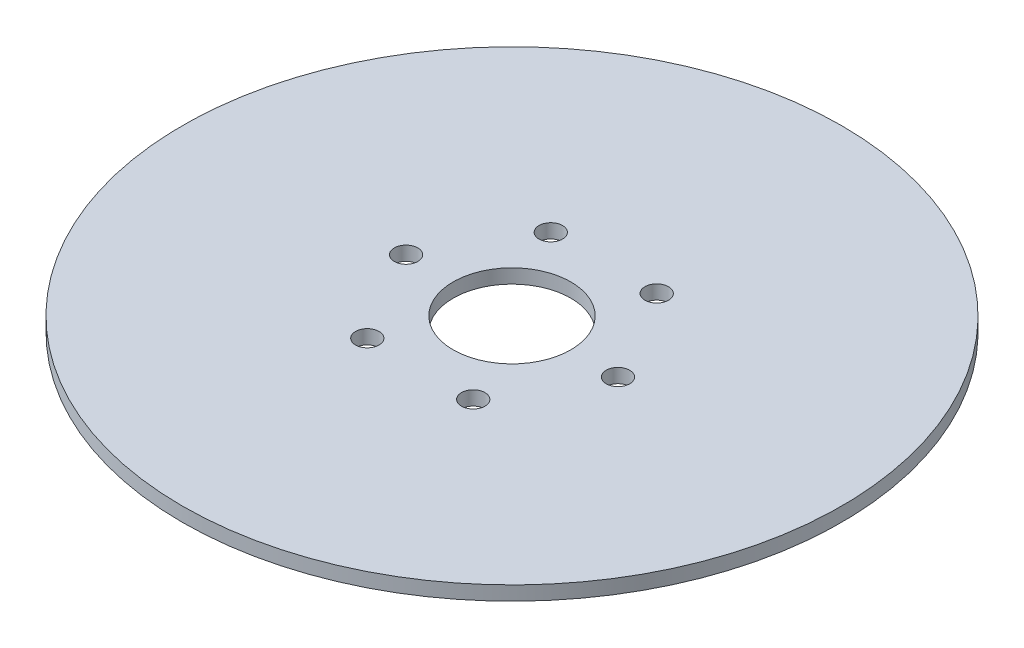
ISO-10303-21;
HEADER;
FILE_DESCRIPTION(('STEP AP214'),'2;1');
FILE_NAME('part.step','',(''),(''),'','','');
FILE_SCHEMA(('AUTOMOTIVE_DESIGN { 1 0 10303 214 1 1 1 1 }'));
ENDSEC;
DATA;
#1=APPLICATION_CONTEXT('core data for automotive mechanical design processes');
#2=APPLICATION_PROTOCOL_DEFINITION('international standard','automotive_design',2000,#1);
#3=PRODUCT_CONTEXT('',#1,'mechanical');
#4=PRODUCT('Part','Part','',(#3));
#5=PRODUCT_RELATED_PRODUCT_CATEGORY('part','',(#4));
#6=PRODUCT_DEFINITION_FORMATION('','',#4);
#7=PRODUCT_DEFINITION_CONTEXT('part definition',#1,'design');
#8=PRODUCT_DEFINITION('design','',#6,#7);
#9=PRODUCT_DEFINITION_SHAPE('','',#8);
#10=(LENGTH_UNIT() NAMED_UNIT(*) SI_UNIT(.MILLI.,.METRE.));
#11=(NAMED_UNIT(*) PLANE_ANGLE_UNIT() SI_UNIT($,.RADIAN.));
#12=(NAMED_UNIT(*) SI_UNIT($,.STERADIAN.) SOLID_ANGLE_UNIT());
#13=UNCERTAINTY_MEASURE_WITH_UNIT(LENGTH_MEASURE(1.E-05),#10,'distance_accuracy_value','');
#14=(GEOMETRIC_REPRESENTATION_CONTEXT(3) GLOBAL_UNCERTAINTY_ASSIGNED_CONTEXT((#13)) GLOBAL_UNIT_ASSIGNED_CONTEXT((#10,
#11,#12)) REPRESENTATION_CONTEXT('',''));
#15=CARTESIAN_POINT('',(0.,0.,0.));
#16=DIRECTION('',(0.,0.,1.));
#17=DIRECTION('',(1.,0.,0.));
#18=AXIS2_PLACEMENT_3D('',#15,#16,#17);
#19=CARTESIAN_POINT('',(0.,3.,0.));
#20=DIRECTION('',(0.,1.,0.));
#21=DIRECTION('',(0.,0.,1.));
#22=AXIS2_PLACEMENT_3D('',#19,#20,#21);
#23=PLANE('',#22);
#24=CARTESIAN_POINT('',(-11.2499999999998,3.,-19.48557158515));
#25=DIRECTION('',(0.,1.,0.));
#26=DIRECTION('',(0.,0.,1.));
#27=AXIS2_PLACEMENT_3D('',#24,#25,#26);
#28=CIRCLE('',#27,2.5);
#29=CARTESIAN_POINT('',(-11.2499999999998,3.,-16.98557158515));
#30=VERTEX_POINT('',#29);
#31=EDGE_CURVE('E74',#30,#30,#28,.T.);
#32=ORIENTED_EDGE('',*,*,#31,.F.);
#33=EDGE_LOOP('',(#32));
#34=FACE_BOUND('',#33,.T.);
#35=CARTESIAN_POINT('',(-11.2500000000001,3.,19.4855715851498));
#36=DIRECTION('',(0.,1.,0.));
#37=DIRECTION('',(0.,0.,1.));
#38=AXIS2_PLACEMENT_3D('',#35,#36,#37);
#39=CIRCLE('',#38,2.5);
#40=CARTESIAN_POINT('',(-11.2500000000001,3.,21.9855715851498));
#41=VERTEX_POINT('',#40);
#42=EDGE_CURVE('E62',#41,#41,#39,.T.);
#43=ORIENTED_EDGE('',*,*,#42,.F.);
#44=EDGE_LOOP('',(#43));
#45=FACE_BOUND('',#44,.T.);
#46=CARTESIAN_POINT('',(22.5,3.,0.));
#47=DIRECTION('',(0.,1.,0.));
#48=DIRECTION('',(0.,0.,1.));
#49=AXIS2_PLACEMENT_3D('',#46,#47,#48);
#50=CIRCLE('',#49,2.5);
#51=CARTESIAN_POINT('',(22.5,3.,2.5));
#52=VERTEX_POINT('',#51);
#53=EDGE_CURVE('E50',#52,#52,#50,.T.);
#54=ORIENTED_EDGE('',*,*,#53,.F.);
#55=EDGE_LOOP('',(#54));
#56=FACE_BOUND('',#55,.T.);
#57=CARTESIAN_POINT('',(0.,3.,0.));
#58=DIRECTION('',(0.,1.,0.));
#59=DIRECTION('',(0.,0.,1.));
#60=AXIS2_PLACEMENT_3D('',#57,#58,#59);
#61=CIRCLE('',#60,70.);
#62=CARTESIAN_POINT('',(0.,3.,70.));
#63=VERTEX_POINT('',#62);
#64=EDGE_CURVE('E10',#63,#63,#61,.T.);
#65=ORIENTED_EDGE('',*,*,#64,.T.);
#66=EDGE_LOOP('',(#65));
#67=FACE_BOUND('',#66,.T.);
#68=CARTESIAN_POINT('',(0.,3.,0.));
#69=DIRECTION('',(0.,1.,0.));
#70=DIRECTION('',(0.,0.,1.));
#71=AXIS2_PLACEMENT_3D('',#68,#69,#70);
#72=CIRCLE('',#71,12.5);
#73=CARTESIAN_POINT('',(0.,3.,12.5));
#74=VERTEX_POINT('',#73);
#75=EDGE_CURVE('E45',#74,#74,#72,.T.);
#76=ORIENTED_EDGE('',*,*,#75,.F.);
#77=EDGE_LOOP('',(#76));
#78=FACE_BOUND('',#77,.T.);
#79=CARTESIAN_POINT('',(11.25,3.,19.4855715851499));
#80=DIRECTION('',(0.,1.,0.));
#81=DIRECTION('',(0.,0.,1.));
#82=AXIS2_PLACEMENT_3D('',#79,#80,#81);
#83=CIRCLE('',#82,2.5);
#84=CARTESIAN_POINT('',(11.25,3.,21.9855715851499));
#85=VERTEX_POINT('',#84);
#86=EDGE_CURVE('E56',#85,#85,#83,.T.);
#87=ORIENTED_EDGE('',*,*,#86,.F.);
#88=EDGE_LOOP('',(#87));
#89=FACE_BOUND('',#88,.T.);
#90=CARTESIAN_POINT('',(-22.5,3.,-1.56992474575901E-13));
#91=DIRECTION('',(0.,1.,0.));
#92=DIRECTION('',(0.,0.,1.));
#93=AXIS2_PLACEMENT_3D('',#90,#91,#92);
#94=CIRCLE('',#93,2.5);
#95=CARTESIAN_POINT('',(-22.5,3.,2.49999999999984));
#96=VERTEX_POINT('',#95);
#97=EDGE_CURVE('E68',#96,#96,#94,.T.);
#98=ORIENTED_EDGE('',*,*,#97,.F.);
#99=EDGE_LOOP('',(#98));
#100=FACE_BOUND('',#99,.T.);
#101=CARTESIAN_POINT('',(11.2500000000002,3.,-19.4855715851497));
#102=DIRECTION('',(0.,1.,0.));
#103=DIRECTION('',(0.,0.,1.));
#104=AXIS2_PLACEMENT_3D('',#101,#102,#103);
#105=CIRCLE('',#104,2.5);
#106=CARTESIAN_POINT('',(11.2500000000002,3.,-16.9855715851497));
#107=VERTEX_POINT('',#106);
#108=EDGE_CURVE('E80',#107,#107,#105,.T.);
#109=ORIENTED_EDGE('',*,*,#108,.F.);
#110=EDGE_LOOP('',(#109));
#111=FACE_BOUND('',#110,.T.);
#112=ADVANCED_FACE('F34',(#34,#45,#56,#67,#78,#89,#100,#111),#23,.T.);
#113=CARTESIAN_POINT('',(0.,0.,0.));
#114=DIRECTION('',(0.,1.,0.));
#115=DIRECTION('',(0.,0.,1.));
#116=AXIS2_PLACEMENT_3D('',#113,#114,#115);
#117=PLANE('',#116);
#118=CARTESIAN_POINT('',(0.,0.,0.));
#119=DIRECTION('',(0.,1.,0.));
#120=DIRECTION('',(0.,0.,1.));
#121=AXIS2_PLACEMENT_3D('',#118,#119,#120);
#122=CIRCLE('',#121,70.);
#123=CARTESIAN_POINT('',(0.,0.,70.));
#124=VERTEX_POINT('',#123);
#125=EDGE_CURVE('E38',#124,#124,#122,.T.);
#126=ORIENTED_EDGE('',*,*,#125,.F.);
#127=EDGE_LOOP('',(#126));
#128=FACE_BOUND('',#127,.T.);
#129=CARTESIAN_POINT('',(0.,0.,0.));
#130=DIRECTION('',(0.,1.,0.));
#131=DIRECTION('',(0.,0.,1.));
#132=AXIS2_PLACEMENT_3D('',#129,#130,#131);
#133=CIRCLE('',#132,12.5);
#134=CARTESIAN_POINT('',(0.,0.,12.5));
#135=VERTEX_POINT('',#134);
#136=EDGE_CURVE('E47',#135,#135,#133,.T.);
#137=ORIENTED_EDGE('',*,*,#136,.T.);
#138=EDGE_LOOP('',(#137));
#139=FACE_BOUND('',#138,.T.);
#140=CARTESIAN_POINT('',(22.5,0.,0.));
#141=DIRECTION('',(0.,1.,0.));
#142=DIRECTION('',(0.,0.,1.));
#143=AXIS2_PLACEMENT_3D('',#140,#141,#142);
#144=CIRCLE('',#143,2.5);
#145=CARTESIAN_POINT('',(22.5,0.,2.5));
#146=VERTEX_POINT('',#145);
#147=EDGE_CURVE('E53',#146,#146,#144,.T.);
#148=ORIENTED_EDGE('',*,*,#147,.T.);
#149=EDGE_LOOP('',(#148));
#150=FACE_BOUND('',#149,.T.);
#151=CARTESIAN_POINT('',(11.25,0.,19.4855715851499));
#152=DIRECTION('',(0.,1.,0.));
#153=DIRECTION('',(0.,0.,1.));
#154=AXIS2_PLACEMENT_3D('',#151,#152,#153);
#155=CIRCLE('',#154,2.5);
#156=CARTESIAN_POINT('',(11.25,0.,21.9855715851499));
#157=VERTEX_POINT('',#156);
#158=EDGE_CURVE('E59',#157,#157,#155,.T.);
#159=ORIENTED_EDGE('',*,*,#158,.T.);
#160=EDGE_LOOP('',(#159));
#161=FACE_BOUND('',#160,.T.);
#162=CARTESIAN_POINT('',(-11.2500000000001,0.,19.4855715851498));
#163=DIRECTION('',(0.,1.,0.));
#164=DIRECTION('',(0.,0.,1.));
#165=AXIS2_PLACEMENT_3D('',#162,#163,#164);
#166=CIRCLE('',#165,2.5);
#167=CARTESIAN_POINT('',(-11.2500000000001,0.,21.9855715851498));
#168=VERTEX_POINT('',#167);
#169=EDGE_CURVE('E65',#168,#168,#166,.T.);
#170=ORIENTED_EDGE('',*,*,#169,.T.);
#171=EDGE_LOOP('',(#170));
#172=FACE_BOUND('',#171,.T.);
#173=CARTESIAN_POINT('',(-22.5,0.,-1.56992474575901E-13));
#174=DIRECTION('',(0.,1.,0.));
#175=DIRECTION('',(0.,0.,1.));
#176=AXIS2_PLACEMENT_3D('',#173,#174,#175);
#177=CIRCLE('',#176,2.5);
#178=CARTESIAN_POINT('',(-22.5,0.,2.49999999999984));
#179=VERTEX_POINT('',#178);
#180=EDGE_CURVE('E71',#179,#179,#177,.T.);
#181=ORIENTED_EDGE('',*,*,#180,.T.);
#182=EDGE_LOOP('',(#181));
#183=FACE_BOUND('',#182,.T.);
#184=CARTESIAN_POINT('',(-11.2499999999998,0.,-19.48557158515));
#185=DIRECTION('',(0.,1.,0.));
#186=DIRECTION('',(0.,0.,1.));
#187=AXIS2_PLACEMENT_3D('',#184,#185,#186);
#188=CIRCLE('',#187,2.5);
#189=CARTESIAN_POINT('',(-11.2499999999998,0.,-16.98557158515));
#190=VERTEX_POINT('',#189);
#191=EDGE_CURVE('E77',#190,#190,#188,.T.);
#192=ORIENTED_EDGE('',*,*,#191,.T.);
#193=EDGE_LOOP('',(#192));
#194=FACE_BOUND('',#193,.T.);
#195=CARTESIAN_POINT('',(11.2500000000002,0.,-19.4855715851497));
#196=DIRECTION('',(0.,1.,0.));
#197=DIRECTION('',(0.,0.,1.));
#198=AXIS2_PLACEMENT_3D('',#195,#196,#197);
#199=CIRCLE('',#198,2.5);
#200=CARTESIAN_POINT('',(11.2500000000002,0.,-16.9855715851497));
#201=VERTEX_POINT('',#200);
#202=EDGE_CURVE('E83',#201,#201,#199,.T.);
#203=ORIENTED_EDGE('',*,*,#202,.T.);
#204=EDGE_LOOP('',(#203));
#205=FACE_BOUND('',#204,.T.);
#206=ADVANCED_FACE('F93',(#128,#139,#150,#161,#172,#183,#194,#205),#117,.F.);
#207=CARTESIAN_POINT('',(0.,3.,0.));
#208=DIRECTION('',(0.,-1.,0.));
#209=DIRECTION('',(0.,0.,-1.));
#210=AXIS2_PLACEMENT_3D('',#207,#208,#209);
#211=CYLINDRICAL_SURFACE('',#210,70.);
#212=ORIENTED_EDGE('',*,*,#64,.F.);
#213=EDGE_LOOP('',(#212));
#214=FACE_BOUND('',#213,.T.);
#215=ORIENTED_EDGE('',*,*,#125,.T.);
#216=EDGE_LOOP('',(#215));
#217=FACE_BOUND('',#216,.T.);
#218=ADVANCED_FACE('F36',(#214,#217),#211,.T.);
#219=CARTESIAN_POINT('',(0.,3.,0.));
#220=DIRECTION('',(0.,-1.,0.));
#221=DIRECTION('',(0.,0.,-1.));
#222=AXIS2_PLACEMENT_3D('',#219,#220,#221);
#223=CYLINDRICAL_SURFACE('',#222,12.5);
#224=ORIENTED_EDGE('',*,*,#75,.T.);
#225=EDGE_LOOP('',(#224));
#226=FACE_BOUND('',#225,.T.);
#227=ORIENTED_EDGE('',*,*,#136,.F.);
#228=EDGE_LOOP('',(#227));
#229=FACE_BOUND('',#228,.T.);
#230=ADVANCED_FACE('F103',(#226,#229),#223,.F.);
#231=CARTESIAN_POINT('',(22.5,3.,0.));
#232=DIRECTION('',(0.,-1.,0.));
#233=DIRECTION('',(0.,0.,-1.));
#234=AXIS2_PLACEMENT_3D('',#231,#232,#233);
#235=CYLINDRICAL_SURFACE('',#234,2.5);
#236=ORIENTED_EDGE('',*,*,#53,.T.);
#237=EDGE_LOOP('',(#236));
#238=FACE_BOUND('',#237,.T.);
#239=ORIENTED_EDGE('',*,*,#147,.F.);
#240=EDGE_LOOP('',(#239));
#241=FACE_BOUND('',#240,.T.);
#242=ADVANCED_FACE('F106',(#238,#241),#235,.F.);
#243=CARTESIAN_POINT('',(11.25,3.,19.4855715851499));
#244=DIRECTION('',(0.,-1.,0.));
#245=DIRECTION('',(0.,0.,-1.));
#246=AXIS2_PLACEMENT_3D('',#243,#244,#245);
#247=CYLINDRICAL_SURFACE('',#246,2.5);
#248=ORIENTED_EDGE('',*,*,#86,.T.);
#249=EDGE_LOOP('',(#248));
#250=FACE_BOUND('',#249,.T.);
#251=ORIENTED_EDGE('',*,*,#158,.F.);
#252=EDGE_LOOP('',(#251));
#253=FACE_BOUND('',#252,.T.);
#254=ADVANCED_FACE('F110',(#250,#253),#247,.F.);
#255=CARTESIAN_POINT('',(-11.2500000000001,3.,19.4855715851498));
#256=DIRECTION('',(0.,-1.,0.));
#257=DIRECTION('',(0.,0.,-1.));
#258=AXIS2_PLACEMENT_3D('',#255,#256,#257);
#259=CYLINDRICAL_SURFACE('',#258,2.5);
#260=ORIENTED_EDGE('',*,*,#42,.T.);
#261=EDGE_LOOP('',(#260));
#262=FACE_BOUND('',#261,.T.);
#263=ORIENTED_EDGE('',*,*,#169,.F.);
#264=EDGE_LOOP('',(#263));
#265=FACE_BOUND('',#264,.T.);
#266=ADVANCED_FACE('F114',(#262,#265),#259,.F.);
#267=CARTESIAN_POINT('',(-22.5,3.,-1.56992474575901E-13));
#268=DIRECTION('',(0.,-1.,0.));
#269=DIRECTION('',(0.,0.,-1.));
#270=AXIS2_PLACEMENT_3D('',#267,#268,#269);
#271=CYLINDRICAL_SURFACE('',#270,2.5);
#272=ORIENTED_EDGE('',*,*,#97,.T.);
#273=EDGE_LOOP('',(#272));
#274=FACE_BOUND('',#273,.T.);
#275=ORIENTED_EDGE('',*,*,#180,.F.);
#276=EDGE_LOOP('',(#275));
#277=FACE_BOUND('',#276,.T.);
#278=ADVANCED_FACE('F118',(#274,#277),#271,.F.);
#279=CARTESIAN_POINT('',(-11.2499999999998,3.,-19.48557158515));
#280=DIRECTION('',(0.,-1.,0.));
#281=DIRECTION('',(0.,0.,-1.));
#282=AXIS2_PLACEMENT_3D('',#279,#280,#281);
#283=CYLINDRICAL_SURFACE('',#282,2.5);
#284=ORIENTED_EDGE('',*,*,#31,.T.);
#285=EDGE_LOOP('',(#284));
#286=FACE_BOUND('',#285,.T.);
#287=ORIENTED_EDGE('',*,*,#191,.F.);
#288=EDGE_LOOP('',(#287));
#289=FACE_BOUND('',#288,.T.);
#290=ADVANCED_FACE('F122',(#286,#289),#283,.F.);
#291=CARTESIAN_POINT('',(11.2500000000002,3.,-19.4855715851497));
#292=DIRECTION('',(0.,-1.,0.));
#293=DIRECTION('',(0.,0.,-1.));
#294=AXIS2_PLACEMENT_3D('',#291,#292,#293);
#295=CYLINDRICAL_SURFACE('',#294,2.5);
#296=ORIENTED_EDGE('',*,*,#108,.T.);
#297=EDGE_LOOP('',(#296));
#298=FACE_BOUND('',#297,.T.);
#299=ORIENTED_EDGE('',*,*,#202,.F.);
#300=EDGE_LOOP('',(#299));
#301=FACE_BOUND('',#300,.T.);
#302=ADVANCED_FACE('F89',(#298,#301),#295,.F.);
#303=CLOSED_SHELL('',(#112,#206,#218,#230,#242,#254,#266,#278,#290,#302));
#304=MANIFOLD_SOLID_BREP('B2',#303);
#305=ADVANCED_BREP_SHAPE_REPRESENTATION('',(#18,#304),#14);
#306=SHAPE_DEFINITION_REPRESENTATION(#9,#305);
ENDSEC;
END-ISO-10303-21;
